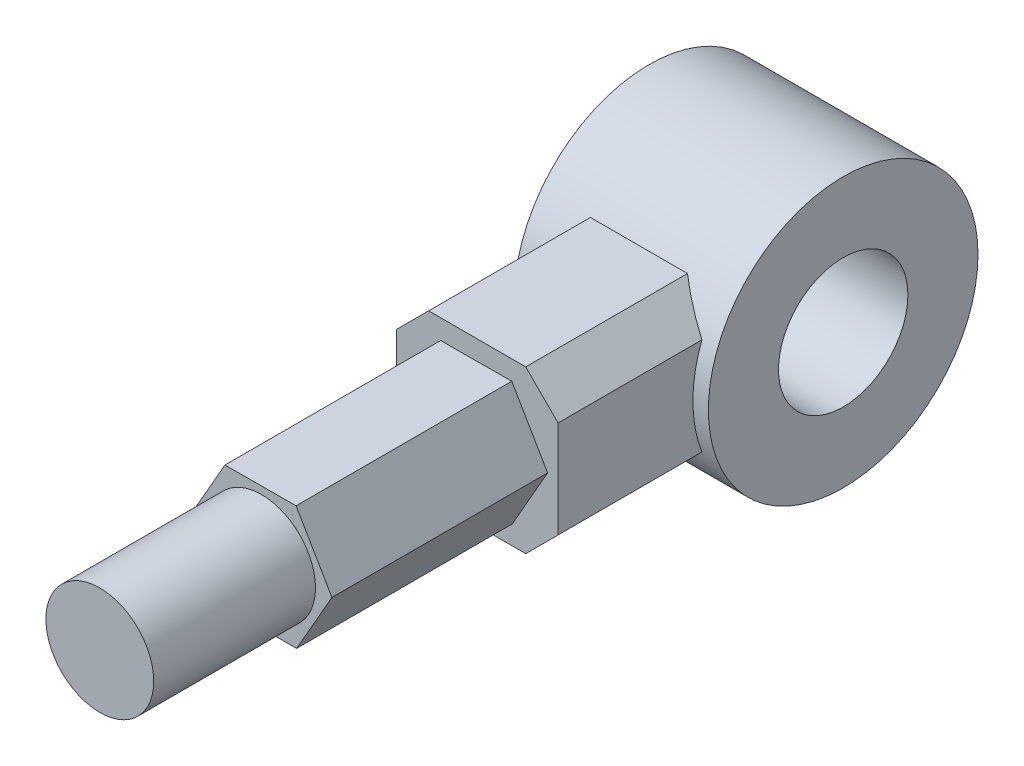
ISO-10303-21;
HEADER;
FILE_DESCRIPTION(('STEP AP214'),'2;1');
FILE_NAME('part.step','',(''),(''),'','','');
FILE_SCHEMA(('AUTOMOTIVE_DESIGN { 1 0 10303 214 1 1 1 1 }'));
ENDSEC;
DATA;
#1=APPLICATION_CONTEXT('core data for automotive mechanical design processes');
#2=APPLICATION_PROTOCOL_DEFINITION('international standard','automotive_design',2000,#1);
#3=PRODUCT_CONTEXT('',#1,'mechanical');
#4=PRODUCT('Part','Part','',(#3));
#5=PRODUCT_RELATED_PRODUCT_CATEGORY('part','',(#4));
#6=PRODUCT_DEFINITION_FORMATION('','',#4);
#7=PRODUCT_DEFINITION_CONTEXT('part definition',#1,'design');
#8=PRODUCT_DEFINITION('design','',#6,#7);
#9=PRODUCT_DEFINITION_SHAPE('','',#8);
#10=(LENGTH_UNIT() NAMED_UNIT(*) SI_UNIT(.MILLI.,.METRE.));
#11=(NAMED_UNIT(*) PLANE_ANGLE_UNIT() SI_UNIT($,.RADIAN.));
#12=(NAMED_UNIT(*) SI_UNIT($,.STERADIAN.) SOLID_ANGLE_UNIT());
#13=UNCERTAINTY_MEASURE_WITH_UNIT(LENGTH_MEASURE(1.E-05),#10,'distance_accuracy_value','');
#14=(GEOMETRIC_REPRESENTATION_CONTEXT(3) GLOBAL_UNCERTAINTY_ASSIGNED_CONTEXT((#13)) GLOBAL_UNIT_ASSIGNED_CONTEXT((#10,
#11,#12)) REPRESENTATION_CONTEXT('',''));
#15=CARTESIAN_POINT('',(0.,0.,0.));
#16=DIRECTION('',(0.,0.,1.));
#17=DIRECTION('',(1.,0.,0.));
#18=AXIS2_PLACEMENT_3D('',#15,#16,#17);
#19=CARTESIAN_POINT('',(18.,0.,0.));
#20=DIRECTION('',(-1.,0.,0.));
#21=DIRECTION('',(0.,0.,1.));
#22=AXIS2_PLACEMENT_3D('',#19,#20,#21);
#23=CYLINDRICAL_SURFACE('',#22,12.5);
#24=CARTESIAN_POINT('',(0.,0.,0.));
#25=DIRECTION('',(1.,0.,0.));
#26=DIRECTION('',(0.,0.,-1.));
#27=AXIS2_PLACEMENT_3D('',#24,#25,#26);
#28=CIRCLE('',#27,12.5);
#29=CARTESIAN_POINT('',(0.,0.,-12.5));
#30=VERTEX_POINT('',#29);
#31=EDGE_CURVE('E189',#30,#30,#28,.T.);
#32=ORIENTED_EDGE('',*,*,#31,.T.);
#33=EDGE_LOOP('',(#32));
#34=FACE_BOUND('',#33,.T.);
#35=CARTESIAN_POINT('',(18.,0.,0.));
#36=DIRECTION('',(1.,0.,0.));
#37=DIRECTION('',(0.,0.,-1.));
#38=AXIS2_PLACEMENT_3D('',#35,#36,#37);
#39=CIRCLE('',#38,12.5);
#40=CARTESIAN_POINT('',(18.,0.,-12.5));
#41=VERTEX_POINT('',#40);
#42=EDGE_CURVE('E192',#41,#41,#39,.T.);
#43=ORIENTED_EDGE('',*,*,#42,.F.);
#44=EDGE_LOOP('',(#43));
#45=FACE_BOUND('',#44,.T.);
#46=CARTESIAN_POINT('',(1.56013600787518,0.,0.));
#47=DIRECTION('',(1.,0.,0.));
#48=DIRECTION('',(0.,1.,0.));
#49=AXIS2_PLACEMENT_3D('',#46,#47,#48);
#50=CIRCLE('',#49,12.5);
#51=CARTESIAN_POINT('',(1.56013600787518,4.49999999999999,11.6619037896906));
#52=VERTEX_POINT('',#51);
#53=CARTESIAN_POINT('',(1.56013600787518,-4.49999999999998,11.6619037896906));
#54=VERTEX_POINT('',#53);
#55=EDGE_CURVE('E182',#52,#54,#50,.T.);
#56=ORIENTED_EDGE('',*,*,#55,.F.);
#57=CARTESIAN_POINT('',(-2.93986399212482,0.,0.));
#58=DIRECTION('',(0.707106781186547,-0.707106781186548,0.));
#59=DIRECTION('',(-0.707106781186548,-0.707106781186547,0.));
#60=AXIS2_PLACEMENT_3D('',#57,#58,#59);
#61=ELLIPSE('',#60,17.6776695296637,12.5);
#62=CARTESIAN_POINT('',(4.5601360078752,7.5,10.));
#63=VERTEX_POINT('',#62);
#64=EDGE_CURVE('E50',#52,#63,#61,.F.);
#65=ORIENTED_EDGE('',*,*,#64,.T.);
#66=DIRECTION('',(-1.,0.,0.));
#67=VECTOR('',#66,1.);
#68=CARTESIAN_POINT('',(18.,7.5,10.));
#69=LINE('',#68,#67);
#70=CARTESIAN_POINT('',(13.5601360078752,7.5,10.));
#71=VERTEX_POINT('',#70);
#72=EDGE_CURVE('E195',#71,#63,#69,.T.);
#73=ORIENTED_EDGE('',*,*,#72,.F.);
#74=CARTESIAN_POINT('',(21.0601360078751,0.,0.));
#75=DIRECTION('',(-0.707106781186548,-0.707106781186547,0.));
#76=DIRECTION('',(-0.707106781186547,0.707106781186548,0.));
#77=AXIS2_PLACEMENT_3D('',#74,#75,#76);
#78=ELLIPSE('',#77,17.6776695296637,12.5);
#79=CARTESIAN_POINT('',(16.5601360078752,4.49999999999998,11.6619037896906));
#80=VERTEX_POINT('',#79);
#81=EDGE_CURVE('E38',#71,#80,#78,.F.);
#82=ORIENTED_EDGE('',*,*,#81,.T.);
#83=CARTESIAN_POINT('',(16.5601360078752,0.,0.));
#84=DIRECTION('',(-1.,0.,0.));
#85=DIRECTION('',(0.,-1.,0.));
#86=AXIS2_PLACEMENT_3D('',#83,#84,#85);
#87=CIRCLE('',#86,12.5);
#88=CARTESIAN_POINT('',(16.5601360078752,-4.49999999999999,11.6619037896906));
#89=VERTEX_POINT('',#88);
#90=EDGE_CURVE('E179',#89,#80,#87,.T.);
#91=ORIENTED_EDGE('',*,*,#90,.F.);
#92=CARTESIAN_POINT('',(21.0601360078752,0.,0.));
#93=DIRECTION('',(-0.707106781186546,0.707106781186549,0.));
#94=DIRECTION('',(-0.707106781186549,-0.707106781186546,0.));
#95=AXIS2_PLACEMENT_3D('',#92,#93,#94);
#96=ELLIPSE('',#95,17.6776695296637,12.5);
#97=CARTESIAN_POINT('',(13.5601360078752,-7.5,10.));
#98=VERTEX_POINT('',#97);
#99=EDGE_CURVE('E231',#89,#98,#96,.F.);
#100=ORIENTED_EDGE('',*,*,#99,.T.);
#101=DIRECTION('',(-1.,0.,0.));
#102=VECTOR('',#101,1.);
#103=CARTESIAN_POINT('',(18.,-7.5,10.));
#104=LINE('',#103,#102);
#105=CARTESIAN_POINT('',(4.56013600787519,-7.5,10.));
#106=VERTEX_POINT('',#105);
#107=EDGE_CURVE('E199',#106,#98,#104,.F.);
#108=ORIENTED_EDGE('',*,*,#107,.F.);
#109=CARTESIAN_POINT('',(-2.93986399212479,0.,0.));
#110=DIRECTION('',(0.707106781186548,0.707106781186547,0.));
#111=DIRECTION('',(-0.707106781186547,0.707106781186548,0.));
#112=AXIS2_PLACEMENT_3D('',#109,#110,#111);
#113=ELLIPSE('',#112,17.6776695296637,12.5);
#114=EDGE_CURVE('E229',#106,#54,#113,.F.);
#115=ORIENTED_EDGE('',*,*,#114,.T.);
#116=EDGE_LOOP('',(#56,#65,#73,#82,#91,#100,#108,#115));
#117=FACE_BOUND('',#116,.T.);
#118=ADVANCED_FACE('F34',(#34,#45,#117),#23,.T.);
#119=CARTESIAN_POINT('',(18.,0.,0.));
#120=DIRECTION('',(-1.,0.,0.));
#121=DIRECTION('',(0.,0.,1.));
#122=AXIS2_PLACEMENT_3D('',#119,#120,#121);
#123=CYLINDRICAL_SURFACE('',#122,6.);
#124=CARTESIAN_POINT('',(18.,0.,0.));
#125=DIRECTION('',(1.,0.,0.));
#126=DIRECTION('',(0.,0.,-1.));
#127=AXIS2_PLACEMENT_3D('',#124,#125,#126);
#128=CIRCLE('',#127,6.);
#129=CARTESIAN_POINT('',(18.,0.,-6.));
#130=VERTEX_POINT('',#129);
#131=EDGE_CURVE('E186',#130,#130,#128,.T.);
#132=ORIENTED_EDGE('',*,*,#131,.T.);
#133=EDGE_LOOP('',(#132));
#134=FACE_BOUND('',#133,.T.);
#135=CARTESIAN_POINT('',(0.,0.,0.));
#136=DIRECTION('',(1.,0.,0.));
#137=DIRECTION('',(0.,0.,-1.));
#138=AXIS2_PLACEMENT_3D('',#135,#136,#137);
#139=CIRCLE('',#138,6.);
#140=CARTESIAN_POINT('',(0.,0.,-6.));
#141=VERTEX_POINT('',#140);
#142=EDGE_CURVE('E185',#141,#141,#139,.T.);
#143=ORIENTED_EDGE('',*,*,#142,.F.);
#144=EDGE_LOOP('',(#143));
#145=FACE_BOUND('',#144,.T.);
#146=ADVANCED_FACE('F272',(#134,#145),#123,.F.);
#147=CARTESIAN_POINT('',(18.,0.,0.));
#148=DIRECTION('',(1.,0.,0.));
#149=DIRECTION('',(0.,0.,-1.));
#150=AXIS2_PLACEMENT_3D('',#147,#148,#149);
#151=PLANE('',#150);
#152=ORIENTED_EDGE('',*,*,#42,.T.);
#153=EDGE_LOOP('',(#152));
#154=FACE_BOUND('',#153,.T.);
#155=ORIENTED_EDGE('',*,*,#131,.F.);
#156=EDGE_LOOP('',(#155));
#157=FACE_BOUND('',#156,.T.);
#158=ADVANCED_FACE('F279',(#154,#157),#151,.T.);
#159=CARTESIAN_POINT('',(0.,0.,0.));
#160=DIRECTION('',(1.,0.,0.));
#161=DIRECTION('',(0.,0.,-1.));
#162=AXIS2_PLACEMENT_3D('',#159,#160,#161);
#163=PLANE('',#162);
#164=ORIENTED_EDGE('',*,*,#31,.F.);
#165=EDGE_LOOP('',(#164));
#166=FACE_BOUND('',#165,.T.);
#167=ORIENTED_EDGE('',*,*,#142,.T.);
#168=EDGE_LOOP('',(#167));
#169=FACE_BOUND('',#168,.T.);
#170=ADVANCED_FACE('F284',(#166,#169),#163,.F.);
#171=CARTESIAN_POINT('',(1.56013600787518,-7.5,25.));
#172=DIRECTION('',(0.,1.,0.));
#173=DIRECTION('',(0.,0.,1.));
#174=AXIS2_PLACEMENT_3D('',#171,#172,#173);
#175=PLANE('',#174);
#176=DIRECTION('',(1.,0.,0.));
#177=VECTOR('',#176,1.);
#178=CARTESIAN_POINT('',(1.56013600787518,-7.5,25.));
#179=LINE('',#178,#177);
#180=CARTESIAN_POINT('',(4.56013600787519,-7.5,25.));
#181=VERTEX_POINT('',#180);
#182=CARTESIAN_POINT('',(13.5601360078752,-7.5,25.));
#183=VERTEX_POINT('',#182);
#184=EDGE_CURVE('E165',#181,#183,#179,.T.);
#185=ORIENTED_EDGE('',*,*,#184,.F.);
#186=DIRECTION('',(0.,0.,-1.));
#187=VECTOR('',#186,1.);
#188=CARTESIAN_POINT('',(4.56013600787519,-7.5,25.));
#189=LINE('',#188,#187);
#190=EDGE_CURVE('E204',#181,#106,#189,.T.);
#191=ORIENTED_EDGE('',*,*,#190,.T.);
#192=ORIENTED_EDGE('',*,*,#107,.T.);
#193=DIRECTION('',(0.,0.,1.));
#194=VECTOR('',#193,1.);
#195=CARTESIAN_POINT('',(13.5601360078752,-7.5,25.));
#196=LINE('',#195,#194);
#197=EDGE_CURVE('E202',#98,#183,#196,.T.);
#198=ORIENTED_EDGE('',*,*,#197,.T.);
#199=EDGE_LOOP('',(#185,#191,#192,#198));
#200=FACE_BOUND('',#199,.T.);
#201=ADVANCED_FACE('F259',(#200),#175,.F.);
#202=CARTESIAN_POINT('',(1.56013600787518,7.5,25.));
#203=DIRECTION('',(0.,-1.,0.));
#204=DIRECTION('',(0.,0.,-1.));
#205=AXIS2_PLACEMENT_3D('',#202,#203,#204);
#206=PLANE('',#205);
#207=ORIENTED_EDGE('',*,*,#72,.T.);
#208=DIRECTION('',(0.,0.,1.));
#209=VECTOR('',#208,1.);
#210=CARTESIAN_POINT('',(4.5601360078752,7.5,25.));
#211=LINE('',#210,#209);
#212=CARTESIAN_POINT('',(4.5601360078752,7.5,25.));
#213=VERTEX_POINT('',#212);
#214=EDGE_CURVE('E227',#63,#213,#211,.T.);
#215=ORIENTED_EDGE('',*,*,#214,.T.);
#216=DIRECTION('',(-1.,0.,0.));
#217=VECTOR('',#216,1.);
#218=CARTESIAN_POINT('',(1.56013600787518,7.5,25.));
#219=LINE('',#218,#217);
#220=CARTESIAN_POINT('',(13.5601360078752,7.5,25.));
#221=VERTEX_POINT('',#220);
#222=EDGE_CURVE('E176',#221,#213,#219,.T.);
#223=ORIENTED_EDGE('',*,*,#222,.F.);
#224=DIRECTION('',(0.,0.,-1.));
#225=VECTOR('',#224,1.);
#226=CARTESIAN_POINT('',(13.5601360078752,7.5,25.));
#227=LINE('',#226,#225);
#228=EDGE_CURVE('E225',#221,#71,#227,.T.);
#229=ORIENTED_EDGE('',*,*,#228,.T.);
#230=EDGE_LOOP('',(#207,#215,#223,#229));
#231=FACE_BOUND('',#230,.T.);
#232=ADVANCED_FACE('F243',(#231),#206,.F.);
#233=CARTESIAN_POINT('',(1.56013600787518,7.5,25.));
#234=DIRECTION('',(1.,0.,0.));
#235=DIRECTION('',(0.,1.,0.));
#236=AXIS2_PLACEMENT_3D('',#233,#234,#235);
#237=PLANE('',#236);
#238=ORIENTED_EDGE('',*,*,#55,.T.);
#239=DIRECTION('',(0.,0.,1.));
#240=VECTOR('',#239,1.);
#241=CARTESIAN_POINT('',(1.56013600787518,-4.49999999999998,25.));
#242=LINE('',#241,#240);
#243=CARTESIAN_POINT('',(1.56013600787518,-4.49999999999998,25.));
#244=VERTEX_POINT('',#243);
#245=EDGE_CURVE('E210',#54,#244,#242,.T.);
#246=ORIENTED_EDGE('',*,*,#245,.T.);
#247=DIRECTION('',(0.,-1.,0.));
#248=VECTOR('',#247,1.);
#249=CARTESIAN_POINT('',(1.56013600787518,7.5,25.));
#250=LINE('',#249,#248);
#251=CARTESIAN_POINT('',(1.56013600787518,4.49999999999999,25.));
#252=VERTEX_POINT('',#251);
#253=EDGE_CURVE('E162',#252,#244,#250,.T.);
#254=ORIENTED_EDGE('',*,*,#253,.F.);
#255=DIRECTION('',(0.,0.,-1.));
#256=VECTOR('',#255,1.);
#257=CARTESIAN_POINT('',(1.56013600787518,4.49999999999999,25.));
#258=LINE('',#257,#256);
#259=EDGE_CURVE('E207',#252,#52,#258,.T.);
#260=ORIENTED_EDGE('',*,*,#259,.T.);
#261=EDGE_LOOP('',(#238,#246,#254,#260));
#262=FACE_BOUND('',#261,.T.);
#263=ADVANCED_FACE('F251',(#262),#237,.F.);
#264=CARTESIAN_POINT('',(16.5601360078752,7.5,25.));
#265=DIRECTION('',(-1.,0.,0.));
#266=DIRECTION('',(0.,-1.,0.));
#267=AXIS2_PLACEMENT_3D('',#264,#265,#266);
#268=PLANE('',#267);
#269=DIRECTION('',(0.,1.,0.));
#270=VECTOR('',#269,1.);
#271=CARTESIAN_POINT('',(16.5601360078752,7.5,25.));
#272=LINE('',#271,#270);
#273=CARTESIAN_POINT('',(16.5601360078752,-4.49999999999999,25.));
#274=VERTEX_POINT('',#273);
#275=CARTESIAN_POINT('',(16.5601360078752,4.49999999999998,25.));
#276=VERTEX_POINT('',#275);
#277=EDGE_CURVE('E173',#274,#276,#272,.T.);
#278=ORIENTED_EDGE('',*,*,#277,.F.);
#279=DIRECTION('',(0.,0.,-1.));
#280=VECTOR('',#279,1.);
#281=CARTESIAN_POINT('',(16.5601360078752,-4.49999999999999,25.));
#282=LINE('',#281,#280);
#283=EDGE_CURVE('E222',#274,#89,#282,.T.);
#284=ORIENTED_EDGE('',*,*,#283,.T.);
#285=ORIENTED_EDGE('',*,*,#90,.T.);
#286=DIRECTION('',(0.,0.,1.));
#287=VECTOR('',#286,1.);
#288=CARTESIAN_POINT('',(16.5601360078752,4.49999999999998,25.));
#289=LINE('',#288,#287);
#290=EDGE_CURVE('E220',#80,#276,#289,.T.);
#291=ORIENTED_EDGE('',*,*,#290,.T.);
#292=EDGE_LOOP('',(#278,#284,#285,#291));
#293=FACE_BOUND('',#292,.T.);
#294=ADVANCED_FACE('F235',(#293),#268,.F.);
#295=CARTESIAN_POINT('',(0.,0.,25.));
#296=DIRECTION('',(0.,0.,1.));
#297=DIRECTION('',(1.,0.,0.));
#298=AXIS2_PLACEMENT_3D('',#295,#296,#297);
#299=PLANE('',#298);
#300=DIRECTION('',(0.496138938356818,0.868243142124468,0.));
#301=VECTOR('',#300,1.);
#302=CARTESIAN_POINT('',(12.3169942453821,-5.72980615396067,25.));
#303=LINE('',#302,#301);
#304=CARTESIAN_POINT('',(12.3169942453821,-5.72980615396067,25.));
#305=VERTEX_POINT('',#304);
#306=CARTESIAN_POINT('',(15.5911691905024,0.,25.));
#307=VERTEX_POINT('',#306);
#308=EDGE_CURVE('E161',#305,#307,#303,.T.);
#309=ORIENTED_EDGE('',*,*,#308,.F.);
#310=DIRECTION('',(0.999990086919821,0.00445264663858573,0.));
#311=VECTOR('',#310,1.);
#312=CARTESIAN_POINT('',(5.71774908473154,-5.75919055203234,25.));
#313=LINE('',#312,#311);
#314=CARTESIAN_POINT('',(5.71774908473154,-5.75919055203234,25.));
#315=VERTEX_POINT('',#314);
#316=EDGE_CURVE('E158',#315,#305,#313,.T.);
#317=ORIENTED_EDGE('',*,*,#316,.F.);
#318=DIRECTION('',(0.503851148563003,-0.86379049548588,0.));
#319=VECTOR('',#318,1.);
#320=CARTESIAN_POINT('',(2.39267886920127,-0.0587687961432585,25.));
#321=LINE('',#320,#319);
#322=CARTESIAN_POINT('',(2.39267886920127,-0.0587687961432585,25.));
#323=VERTEX_POINT('',#322);
#324=EDGE_CURVE('E354',#323,#315,#321,.T.);
#325=ORIENTED_EDGE('',*,*,#324,.F.);
#326=DIRECTION('',(-0.496138938356819,-0.868243142124468,0.));
#327=VECTOR('',#326,1.);
#328=CARTESIAN_POINT('',(5.66685381432157,5.67103735781749,25.));
#329=LINE('',#328,#327);
#330=CARTESIAN_POINT('',(5.66685381432157,5.67103735781749,25.));
#331=VERTEX_POINT('',#330);
#332=EDGE_CURVE('E351',#331,#323,#329,.T.);
#333=ORIENTED_EDGE('',*,*,#332,.F.);
#334=DIRECTION('',(-0.999990086919821,-0.00445264663858731,0.));
#335=VECTOR('',#334,1.);
#336=CARTESIAN_POINT('',(12.2660989749721,5.70042175588917,25.));
#337=LINE('',#336,#335);
#338=CARTESIAN_POINT('',(12.2660989749721,5.70042175588917,25.));
#339=VERTEX_POINT('',#338);
#340=EDGE_CURVE('E348',#339,#331,#337,.T.);
#341=ORIENTED_EDGE('',*,*,#340,.F.);
#342=DIRECTION('',(-0.503851148563003,0.86379049548588,0.));
#343=VECTOR('',#342,1.);
#344=CARTESIAN_POINT('',(15.5911691905024,0.,25.));
#345=LINE('',#344,#343);
#346=EDGE_CURVE('E337',#307,#339,#345,.T.);
#347=ORIENTED_EDGE('',*,*,#346,.F.);
#348=EDGE_LOOP('',(#309,#317,#325,#333,#341,#347));
#349=FACE_BOUND('',#348,.T.);
#350=ORIENTED_EDGE('',*,*,#253,.T.);
#351=DIRECTION('',(-0.707106781186547,0.707106781186548,0.));
#352=VECTOR('',#351,1.);
#353=CARTESIAN_POINT('',(-1.4699319960624,-1.4699319960624,25.));
#354=LINE('',#353,#352);
#355=EDGE_CURVE('E218',#244,#181,#354,.F.);
#356=ORIENTED_EDGE('',*,*,#355,.T.);
#357=ORIENTED_EDGE('',*,*,#184,.T.);
#358=DIRECTION('',(-0.707106781186549,-0.707106781186546,0.));
#359=VECTOR('',#358,1.);
#360=CARTESIAN_POINT('',(10.5300680039376,-10.5300680039376,25.));
#361=LINE('',#360,#359);
#362=EDGE_CURVE('E216',#183,#274,#361,.F.);
#363=ORIENTED_EDGE('',*,*,#362,.T.);
#364=ORIENTED_EDGE('',*,*,#277,.T.);
#365=DIRECTION('',(0.707106781186547,-0.707106781186548,0.));
#366=VECTOR('',#365,1.);
#367=CARTESIAN_POINT('',(10.5300680039376,10.5300680039376,25.));
#368=LINE('',#367,#366);
#369=EDGE_CURVE('E212',#276,#221,#368,.F.);
#370=ORIENTED_EDGE('',*,*,#369,.T.);
#371=ORIENTED_EDGE('',*,*,#222,.T.);
#372=DIRECTION('',(0.707106781186548,0.707106781186547,0.));
#373=VECTOR('',#372,1.);
#374=CARTESIAN_POINT('',(-1.46993199606241,1.46993199606241,25.));
#375=LINE('',#374,#373);
#376=EDGE_CURVE('E214',#213,#252,#375,.F.);
#377=ORIENTED_EDGE('',*,*,#376,.T.);
#378=EDGE_LOOP('',(#350,#356,#357,#363,#364,#370,#371,#377));
#379=FACE_BOUND('',#378,.T.);
#380=ADVANCED_FACE('F240',(#349,#379),#299,.T.);
#381=CARTESIAN_POINT('',(12.3169942453821,-5.72980615396067,45.));
#382=DIRECTION('',(-0.868243142124468,0.496138938356818,0.));
#383=DIRECTION('',(-0.496138938356818,-0.868243142124468,0.));
#384=AXIS2_PLACEMENT_3D('',#381,#382,#383);
#385=PLANE('',#384);
#386=ORIENTED_EDGE('',*,*,#308,.T.);
#387=DIRECTION('',(0.,0.,-1.));
#388=VECTOR('',#387,1.);
#389=CARTESIAN_POINT('',(15.5911691905024,0.,45.));
#390=LINE('',#389,#388);
#391=CARTESIAN_POINT('',(15.5911691905024,0.,45.));
#392=VERTEX_POINT('',#391);
#393=EDGE_CURVE('E142',#392,#307,#390,.T.);
#394=ORIENTED_EDGE('',*,*,#393,.F.);
#395=DIRECTION('',(0.496138938356818,0.868243142124468,0.));
#396=VECTOR('',#395,1.);
#397=CARTESIAN_POINT('',(12.3169942453821,-5.72980615396067,45.));
#398=LINE('',#397,#396);
#399=CARTESIAN_POINT('',(12.3169942453821,-5.72980615396067,45.));
#400=VERTEX_POINT('',#399);
#401=EDGE_CURVE('E149',#400,#392,#398,.T.);
#402=ORIENTED_EDGE('',*,*,#401,.F.);
#403=DIRECTION('',(0.,0.,-1.));
#404=VECTOR('',#403,1.);
#405=CARTESIAN_POINT('',(12.3169942453821,-5.72980615396067,45.));
#406=LINE('',#405,#404);
#407=EDGE_CURVE('E345',#400,#305,#406,.T.);
#408=ORIENTED_EDGE('',*,*,#407,.T.);
#409=EDGE_LOOP('',(#386,#394,#402,#408));
#410=FACE_BOUND('',#409,.T.);
#411=ADVANCED_FACE('F160',(#410),#385,.F.);
#412=CARTESIAN_POINT('',(15.5911691905024,0.,45.));
#413=DIRECTION('',(-0.86379049548588,-0.503851148563003,0.));
#414=DIRECTION('',(0.503851148563003,-0.86379049548588,0.));
#415=AXIS2_PLACEMENT_3D('',#412,#413,#414);
#416=PLANE('',#415);
#417=ORIENTED_EDGE('',*,*,#346,.T.);
#418=DIRECTION('',(0.,0.,-1.));
#419=VECTOR('',#418,1.);
#420=CARTESIAN_POINT('',(12.2660989749721,5.70042175588917,45.));
#421=LINE('',#420,#419);
#422=CARTESIAN_POINT('',(12.2660989749721,5.70042175588917,45.));
#423=VERTEX_POINT('',#422);
#424=EDGE_CURVE('E145',#423,#339,#421,.T.);
#425=ORIENTED_EDGE('',*,*,#424,.F.);
#426=DIRECTION('',(-0.503851148563003,0.86379049548588,0.));
#427=VECTOR('',#426,1.);
#428=CARTESIAN_POINT('',(15.5911691905024,0.,45.));
#429=LINE('',#428,#427);
#430=EDGE_CURVE('E137',#392,#423,#429,.T.);
#431=ORIENTED_EDGE('',*,*,#430,.F.);
#432=ORIENTED_EDGE('',*,*,#393,.T.);
#433=EDGE_LOOP('',(#417,#425,#431,#432));
#434=FACE_BOUND('',#433,.T.);
#435=ADVANCED_FACE('F140',(#434),#416,.F.);
#436=CARTESIAN_POINT('',(12.2660989749721,5.70042175588917,45.));
#437=DIRECTION('',(0.00445264663858731,-0.999990086919821,0.));
#438=DIRECTION('',(0.999990086919821,0.00445264663858731,0.));
#439=AXIS2_PLACEMENT_3D('',#436,#437,#438);
#440=PLANE('',#439);
#441=ORIENTED_EDGE('',*,*,#340,.T.);
#442=DIRECTION('',(0.,0.,-1.));
#443=VECTOR('',#442,1.);
#444=CARTESIAN_POINT('',(5.66685381432157,5.67103735781749,45.));
#445=LINE('',#444,#443);
#446=CARTESIAN_POINT('',(5.66685381432157,5.67103735781749,45.));
#447=VERTEX_POINT('',#446);
#448=EDGE_CURVE('E167',#447,#331,#445,.T.);
#449=ORIENTED_EDGE('',*,*,#448,.F.);
#450=DIRECTION('',(-0.999990086919821,-0.00445264663858731,0.));
#451=VECTOR('',#450,1.);
#452=CARTESIAN_POINT('',(12.2660989749721,5.70042175588917,45.));
#453=LINE('',#452,#451);
#454=EDGE_CURVE('E148',#423,#447,#453,.T.);
#455=ORIENTED_EDGE('',*,*,#454,.F.);
#456=ORIENTED_EDGE('',*,*,#424,.T.);
#457=EDGE_LOOP('',(#441,#449,#455,#456));
#458=FACE_BOUND('',#457,.T.);
#459=ADVANCED_FACE('F305',(#458),#440,.F.);
#460=CARTESIAN_POINT('',(5.66685381432157,5.67103735781749,45.));
#461=DIRECTION('',(0.868243142124468,-0.496138938356819,0.));
#462=DIRECTION('',(0.496138938356819,0.868243142124468,0.));
#463=AXIS2_PLACEMENT_3D('',#460,#461,#462);
#464=PLANE('',#463);
#465=ORIENTED_EDGE('',*,*,#332,.T.);
#466=DIRECTION('',(0.,0.,-1.));
#467=VECTOR('',#466,1.);
#468=CARTESIAN_POINT('',(2.39267886920127,-0.0587687961432585,45.));
#469=LINE('',#468,#467);
#470=CARTESIAN_POINT('',(2.39267886920127,-0.0587687961432585,45.));
#471=VERTEX_POINT('',#470);
#472=EDGE_CURVE('E363',#471,#323,#469,.T.);
#473=ORIENTED_EDGE('',*,*,#472,.F.);
#474=DIRECTION('',(-0.496138938356819,-0.868243142124468,0.));
#475=VECTOR('',#474,1.);
#476=CARTESIAN_POINT('',(5.66685381432157,5.67103735781749,45.));
#477=LINE('',#476,#475);
#478=EDGE_CURVE('E341',#447,#471,#477,.T.);
#479=ORIENTED_EDGE('',*,*,#478,.F.);
#480=ORIENTED_EDGE('',*,*,#448,.T.);
#481=EDGE_LOOP('',(#465,#473,#479,#480));
#482=FACE_BOUND('',#481,.T.);
#483=ADVANCED_FACE('F308',(#482),#464,.F.);
#484=CARTESIAN_POINT('',(2.39267886920127,-0.0587687961432585,45.));
#485=DIRECTION('',(0.86379049548588,0.503851148563003,0.));
#486=DIRECTION('',(-0.503851148563003,0.86379049548588,0.));
#487=AXIS2_PLACEMENT_3D('',#484,#485,#486);
#488=PLANE('',#487);
#489=ORIENTED_EDGE('',*,*,#324,.T.);
#490=DIRECTION('',(0.,0.,-1.));
#491=VECTOR('',#490,1.);
#492=CARTESIAN_POINT('',(5.71774908473154,-5.75919055203234,45.));
#493=LINE('',#492,#491);
#494=CARTESIAN_POINT('',(5.71774908473154,-5.75919055203234,45.));
#495=VERTEX_POINT('',#494);
#496=EDGE_CURVE('E360',#495,#315,#493,.T.);
#497=ORIENTED_EDGE('',*,*,#496,.F.);
#498=DIRECTION('',(0.503851148563003,-0.86379049548588,0.));
#499=VECTOR('',#498,1.);
#500=CARTESIAN_POINT('',(2.39267886920127,-0.0587687961432585,45.));
#501=LINE('',#500,#499);
#502=EDGE_CURVE('E343',#471,#495,#501,.T.);
#503=ORIENTED_EDGE('',*,*,#502,.F.);
#504=ORIENTED_EDGE('',*,*,#472,.T.);
#505=EDGE_LOOP('',(#489,#497,#503,#504));
#506=FACE_BOUND('',#505,.T.);
#507=ADVANCED_FACE('F312',(#506),#488,.F.);
#508=CARTESIAN_POINT('',(5.71774908473154,-5.75919055203234,45.));
#509=DIRECTION('',(-0.00445264663858573,0.999990086919821,0.));
#510=DIRECTION('',(-0.999990086919821,-0.00445264663858573,0.));
#511=AXIS2_PLACEMENT_3D('',#508,#509,#510);
#512=PLANE('',#511);
#513=ORIENTED_EDGE('',*,*,#316,.T.);
#514=ORIENTED_EDGE('',*,*,#407,.F.);
#515=DIRECTION('',(0.999990086919821,0.00445264663858573,0.));
#516=VECTOR('',#515,1.);
#517=CARTESIAN_POINT('',(5.71774908473154,-5.75919055203234,45.));
#518=LINE('',#517,#516);
#519=EDGE_CURVE('E154',#495,#400,#518,.T.);
#520=ORIENTED_EDGE('',*,*,#519,.F.);
#521=ORIENTED_EDGE('',*,*,#496,.T.);
#522=EDGE_LOOP('',(#513,#514,#520,#521));
#523=FACE_BOUND('',#522,.T.);
#524=ADVANCED_FACE('F316',(#523),#512,.F.);
#525=CARTESIAN_POINT('',(0.,0.,45.));
#526=DIRECTION('',(0.,0.,1.));
#527=DIRECTION('',(1.,0.,0.));
#528=AXIS2_PLACEMENT_3D('',#525,#526,#527);
#529=PLANE('',#528);
#530=CARTESIAN_POINT('',(9.06665213395374,0.,45.));
#531=DIRECTION('',(0.,0.,1.));
#532=DIRECTION('',(1.,0.,0.));
#533=AXIS2_PLACEMENT_3D('',#530,#531,#532);
#534=CIRCLE('',#533,5.);
#535=CARTESIAN_POINT('',(14.0666521339537,0.,45.));
#536=VERTEX_POINT('',#535);
#537=EDGE_CURVE('E11',#536,#536,#534,.T.);
#538=ORIENTED_EDGE('',*,*,#537,.F.);
#539=EDGE_LOOP('',(#538));
#540=FACE_BOUND('',#539,.T.);
#541=ORIENTED_EDGE('',*,*,#401,.T.);
#542=ORIENTED_EDGE('',*,*,#430,.T.);
#543=ORIENTED_EDGE('',*,*,#454,.T.);
#544=ORIENTED_EDGE('',*,*,#478,.T.);
#545=ORIENTED_EDGE('',*,*,#502,.T.);
#546=ORIENTED_EDGE('',*,*,#519,.T.);
#547=EDGE_LOOP('',(#541,#542,#543,#544,#545,#546));
#548=FACE_BOUND('',#547,.T.);
#549=ADVANCED_FACE('F152',(#540,#548),#529,.T.);
#550=CARTESIAN_POINT('',(4.56013600787519,-7.5,25.));
#551=DIRECTION('',(0.707106781186548,0.707106781186547,0.));
#552=DIRECTION('',(0.,0.,-1.));
#553=AXIS2_PLACEMENT_3D('',#550,#551,#552);
#554=PLANE('',#553);
#555=ORIENTED_EDGE('',*,*,#355,.F.);
#556=ORIENTED_EDGE('',*,*,#245,.F.);
#557=ORIENTED_EDGE('',*,*,#114,.F.);
#558=ORIENTED_EDGE('',*,*,#190,.F.);
#559=EDGE_LOOP('',(#555,#556,#557,#558));
#560=FACE_BOUND('',#559,.T.);
#561=ADVANCED_FACE('F254',(#560),#554,.F.);
#562=CARTESIAN_POINT('',(16.5601360078752,-4.49999999999999,25.));
#563=DIRECTION('',(-0.707106781186546,0.707106781186549,0.));
#564=DIRECTION('',(0.,0.,-1.));
#565=AXIS2_PLACEMENT_3D('',#562,#563,#564);
#566=PLANE('',#565);
#567=ORIENTED_EDGE('',*,*,#362,.F.);
#568=ORIENTED_EDGE('',*,*,#197,.F.);
#569=ORIENTED_EDGE('',*,*,#99,.F.);
#570=ORIENTED_EDGE('',*,*,#283,.F.);
#571=EDGE_LOOP('',(#567,#568,#569,#570));
#572=FACE_BOUND('',#571,.T.);
#573=ADVANCED_FACE('F263',(#572),#566,.F.);
#574=CARTESIAN_POINT('',(1.56013600787518,4.49999999999999,25.));
#575=DIRECTION('',(0.707106781186547,-0.707106781186548,0.));
#576=DIRECTION('',(0.,0.,-1.));
#577=AXIS2_PLACEMENT_3D('',#574,#575,#576);
#578=PLANE('',#577);
#579=ORIENTED_EDGE('',*,*,#376,.F.);
#580=ORIENTED_EDGE('',*,*,#214,.F.);
#581=ORIENTED_EDGE('',*,*,#64,.F.);
#582=ORIENTED_EDGE('',*,*,#259,.F.);
#583=EDGE_LOOP('',(#579,#580,#581,#582));
#584=FACE_BOUND('',#583,.T.);
#585=ADVANCED_FACE('F246',(#584),#578,.F.);
#586=CARTESIAN_POINT('',(13.5601360078752,7.5,25.));
#587=DIRECTION('',(-0.707106781186548,-0.707106781186547,0.));
#588=DIRECTION('',(0.,0.,-1.));
#589=AXIS2_PLACEMENT_3D('',#586,#587,#588);
#590=PLANE('',#589);
#591=ORIENTED_EDGE('',*,*,#369,.F.);
#592=ORIENTED_EDGE('',*,*,#290,.F.);
#593=ORIENTED_EDGE('',*,*,#81,.F.);
#594=ORIENTED_EDGE('',*,*,#228,.F.);
#595=EDGE_LOOP('',(#591,#592,#593,#594));
#596=FACE_BOUND('',#595,.T.);
#597=ADVANCED_FACE('F36',(#596),#590,.F.);
#598=CARTESIAN_POINT('',(9.06665213395374,0.,60.));
#599=DIRECTION('',(0.,0.,-1.));
#600=DIRECTION('',(-1.,0.,0.));
#601=AXIS2_PLACEMENT_3D('',#598,#599,#600);
#602=CYLINDRICAL_SURFACE('',#601,5.);
#603=CARTESIAN_POINT('',(9.06665213395374,0.,60.));
#604=DIRECTION('',(0.,0.,1.));
#605=DIRECTION('',(1.,0.,0.));
#606=AXIS2_PLACEMENT_3D('',#603,#604,#605);
#607=CIRCLE('',#606,5.);
#608=CARTESIAN_POINT('',(14.0666521339537,0.,60.));
#609=VERTEX_POINT('',#608);
#610=EDGE_CURVE('E335',#609,#609,#607,.T.);
#611=ORIENTED_EDGE('',*,*,#610,.F.);
#612=EDGE_LOOP('',(#611));
#613=FACE_BOUND('',#612,.T.);
#614=ORIENTED_EDGE('',*,*,#537,.T.);
#615=EDGE_LOOP('',(#614));
#616=FACE_BOUND('',#615,.T.);
#617=ADVANCED_FACE('F324',(#613,#616),#602,.T.);
#618=CARTESIAN_POINT('',(9.06665213395374,0.,60.));
#619=DIRECTION('',(0.,0.,1.));
#620=DIRECTION('',(1.,0.,0.));
#621=AXIS2_PLACEMENT_3D('',#618,#619,#620);
#622=PLANE('',#621);
#623=ORIENTED_EDGE('',*,*,#610,.T.);
#624=EDGE_LOOP('',(#623));
#625=FACE_BOUND('',#624,.T.);
#626=ADVANCED_FACE('F327',(#625),#622,.T.);
#627=CLOSED_SHELL('',(#118,#146,#158,#170,#201,#232,#263,#294,#380,#411,#435,#459,#483,#507,
#524,#549,#561,#573,#585,#597,#617,#626));
#628=MANIFOLD_SOLID_BREP('B2',#627);
#629=ADVANCED_BREP_SHAPE_REPRESENTATION('',(#18,#628),#14);
#630=SHAPE_DEFINITION_REPRESENTATION(#9,#629);
ENDSEC;
END-ISO-10303-21;
